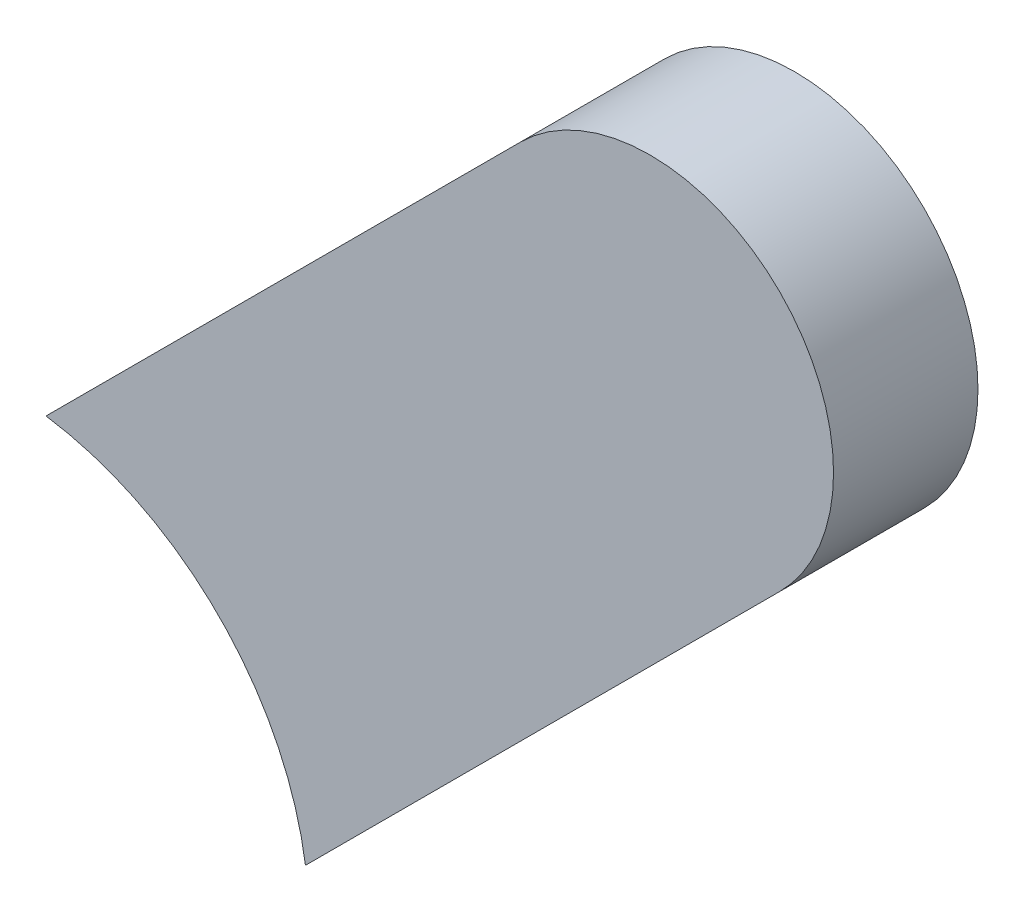
ISO-10303-21;
HEADER;
FILE_DESCRIPTION(('STEP AP214'),'2;1');
FILE_NAME('part.step','',(''),(''),'','','');
FILE_SCHEMA(('AUTOMOTIVE_DESIGN { 1 0 10303 214 1 1 1 1 }'));
ENDSEC;
DATA;
#1=APPLICATION_CONTEXT('core data for automotive mechanical design processes');
#2=APPLICATION_PROTOCOL_DEFINITION('international standard','automotive_design',2000,#1);
#3=PRODUCT_CONTEXT('',#1,'mechanical');
#4=PRODUCT('Part','Part','',(#3));
#5=PRODUCT_RELATED_PRODUCT_CATEGORY('part','',(#4));
#6=PRODUCT_DEFINITION_FORMATION('','',#4);
#7=PRODUCT_DEFINITION_CONTEXT('part definition',#1,'design');
#8=PRODUCT_DEFINITION('design','',#6,#7);
#9=PRODUCT_DEFINITION_SHAPE('','',#8);
#10=(LENGTH_UNIT() NAMED_UNIT(*) SI_UNIT(.MILLI.,.METRE.));
#11=(NAMED_UNIT(*) PLANE_ANGLE_UNIT() SI_UNIT($,.RADIAN.));
#12=(NAMED_UNIT(*) SI_UNIT($,.STERADIAN.) SOLID_ANGLE_UNIT());
#13=UNCERTAINTY_MEASURE_WITH_UNIT(LENGTH_MEASURE(1.E-05),#10,'distance_accuracy_value','');
#14=(GEOMETRIC_REPRESENTATION_CONTEXT(3) GLOBAL_UNCERTAINTY_ASSIGNED_CONTEXT((#13)) GLOBAL_UNIT_ASSIGNED_CONTEXT((#10,
#11,#12)) REPRESENTATION_CONTEXT('',''));
#15=CARTESIAN_POINT('',(0.,0.,0.));
#16=DIRECTION('',(0.,0.,1.));
#17=DIRECTION('',(1.,0.,0.));
#18=AXIS2_PLACEMENT_3D('',#15,#16,#17);
#19=CARTESIAN_POINT('',(110.91055071545,118.61274003545,0.));
#20=DIRECTION('',(-0.707106781186548,0.707106781186548,0.));
#21=DIRECTION('',(0.707106781186548,0.707106781186548,0.));
#22=AXIS2_PLACEMENT_3D('',#19,#20,#21);
#23=PLANE('',#22);
#24=DIRECTION('',(0.707106781186548,0.707106781186548,0.));
#25=VECTOR('',#24,1.);
#26=CARTESIAN_POINT('',(110.66960594,118.37179526,0.1999996));
#27=LINE('',#26,#25);
#28=CARTESIAN_POINT('',(110.91055071545,118.61274003545,0.1999996));
#29=VERTEX_POINT('',#28);
#30=CARTESIAN_POINT('',(111.56734354,119.26953286,0.1999996));
#31=VERTEX_POINT('',#30);
#32=EDGE_CURVE('E11',#29,#31,#27,.T.);
#33=ORIENTED_EDGE('',*,*,#32,.F.);
#34=DIRECTION('',(0.,0.,1.));
#35=VECTOR('',#34,1.);
#36=CARTESIAN_POINT('',(110.91055071545,118.61274003545,0.));
#37=LINE('',#36,#35);
#38=CARTESIAN_POINT('',(110.91055071545,118.61274003545,0.));
#39=VERTEX_POINT('',#38);
#40=EDGE_CURVE('E24',#39,#29,#37,.T.);
#41=ORIENTED_EDGE('',*,*,#40,.F.);
#42=DIRECTION('',(0.707106781186548,0.707106781186548,0.));
#43=VECTOR('',#42,1.);
#44=CARTESIAN_POINT('',(110.66960594,118.37179526,0.));
#45=LINE('',#44,#43);
#46=CARTESIAN_POINT('',(111.56734354,119.26953286,0.));
#47=VERTEX_POINT('',#46);
#48=EDGE_CURVE('E75',#39,#47,#45,.T.);
#49=ORIENTED_EDGE('',*,*,#48,.T.);
#50=DIRECTION('',(0.,0.,1.));
#51=VECTOR('',#50,1.);
#52=CARTESIAN_POINT('',(111.56734354,119.26953286,0.));
#53=LINE('',#52,#51);
#54=EDGE_CURVE('E37',#47,#31,#53,.T.);
#55=ORIENTED_EDGE('',*,*,#54,.T.);
#56=EDGE_LOOP('',(#33,#41,#49,#55));
#57=FACE_BOUND('',#56,.T.);
#58=ADVANCED_FACE('F17',(#57),#23,.F.);
#59=CARTESIAN_POINT('',(111.3877376,119.4491388,0.));
#60=DIRECTION('',(0.,0.,-1.));
#61=DIRECTION('',(0.70710678118652,-0.707106781186576,0.));
#62=AXIS2_PLACEMENT_3D('',#59,#60,#61);
#63=CYLINDRICAL_SURFACE('',#62,0.254001156230761);
#64=CARTESIAN_POINT('',(111.3877376,119.4491388,0.1999996));
#65=DIRECTION('',(0.,0.,1.));
#66=DIRECTION('',(0.70710678118652,-0.707106781186576,0.));
#67=AXIS2_PLACEMENT_3D('',#64,#65,#66);
#68=CIRCLE('',#67,0.254001156230761);
#69=CARTESIAN_POINT('',(111.20813166,119.62874474,0.1999996));
#70=VERTEX_POINT('',#69);
#71=EDGE_CURVE('E83',#31,#70,#68,.T.);
#72=ORIENTED_EDGE('',*,*,#71,.F.);
#73=ORIENTED_EDGE('',*,*,#54,.F.);
#74=CARTESIAN_POINT('',(111.3877376,119.4491388,0.));
#75=DIRECTION('',(0.,0.,1.));
#76=DIRECTION('',(0.70710678118652,-0.707106781186576,0.));
#77=AXIS2_PLACEMENT_3D('',#74,#75,#76);
#78=CIRCLE('',#77,0.254001156230761);
#79=CARTESIAN_POINT('',(111.20813166,119.62874474,0.));
#80=VERTEX_POINT('',#79);
#81=EDGE_CURVE('E81',#47,#80,#78,.T.);
#82=ORIENTED_EDGE('',*,*,#81,.T.);
#83=DIRECTION('',(0.,0.,1.));
#84=VECTOR('',#83,1.);
#85=CARTESIAN_POINT('',(111.20813166,119.62874474,0.));
#86=LINE('',#85,#84);
#87=EDGE_CURVE('E67',#80,#70,#86,.T.);
#88=ORIENTED_EDGE('',*,*,#87,.T.);
#89=EDGE_LOOP('',(#72,#73,#82,#88));
#90=FACE_BOUND('',#89,.T.);
#91=ADVANCED_FACE('F89',(#90),#63,.T.);
#92=CARTESIAN_POINT('',(111.20813166,119.62874474,0.));
#93=DIRECTION('',(0.707106781186531,-0.707106781186564,0.));
#94=DIRECTION('',(-0.707106781186564,-0.707106781186531,0.));
#95=AXIS2_PLACEMENT_3D('',#92,#93,#94);
#96=PLANE('',#95);
#97=DIRECTION('',(-0.707106781186564,-0.707106781186531,0.));
#98=VECTOR('',#97,1.);
#99=CARTESIAN_POINT('',(111.20813166,119.62874474,0.1999996));
#100=LINE('',#99,#98);
#101=CARTESIAN_POINT('',(110.55133883545,118.97195191545,0.1999996));
#102=VERTEX_POINT('',#101);
#103=EDGE_CURVE('E71',#70,#102,#100,.T.);
#104=ORIENTED_EDGE('',*,*,#103,.F.);
#105=ORIENTED_EDGE('',*,*,#87,.F.);
#106=DIRECTION('',(-0.707106781186564,-0.707106781186531,0.));
#107=VECTOR('',#106,1.);
#108=CARTESIAN_POINT('',(111.20813166,119.62874474,0.));
#109=LINE('',#108,#107);
#110=CARTESIAN_POINT('',(110.55133883545,118.97195191545,0.));
#111=VERTEX_POINT('',#110);
#112=EDGE_CURVE('E63',#80,#111,#109,.T.);
#113=ORIENTED_EDGE('',*,*,#112,.T.);
#114=DIRECTION('',(0.,0.,1.));
#115=VECTOR('',#114,1.);
#116=CARTESIAN_POINT('',(110.55133883545,118.97195191545,0.));
#117=LINE('',#116,#115);
#118=EDGE_CURVE('E53',#111,#102,#117,.T.);
#119=ORIENTED_EDGE('',*,*,#118,.T.);
#120=EDGE_LOOP('',(#104,#105,#113,#119));
#121=FACE_BOUND('',#120,.T.);
#122=ADVANCED_FACE('F66',(#121),#96,.F.);
#123=CARTESIAN_POINT('',(110.49,118.5514012,0.));
#124=DIRECTION('',(0.,0.,-1.));
#125=DIRECTION('',(1.,0.,0.));
#126=AXIS2_PLACEMENT_3D('',#123,#124,#125);
#127=CYLINDRICAL_SURFACE('',#126,0.42500042);
#128=ORIENTED_EDGE('',*,*,#40,.T.);
#129=CARTESIAN_POINT('',(110.49,118.5514012,0.1999996));
#130=DIRECTION('',(0.,0.,1.));
#131=DIRECTION('',(1.,0.,0.));
#132=AXIS2_PLACEMENT_3D('',#129,#130,#131);
#133=CIRCLE('',#132,0.42500042);
#134=EDGE_CURVE('E59',#29,#102,#133,.T.);
#135=ORIENTED_EDGE('',*,*,#134,.T.);
#136=ORIENTED_EDGE('',*,*,#118,.F.);
#137=CARTESIAN_POINT('',(110.49,118.5514012,0.));
#138=DIRECTION('',(0.,0.,1.));
#139=DIRECTION('',(1.,0.,0.));
#140=AXIS2_PLACEMENT_3D('',#137,#138,#139);
#141=CIRCLE('',#140,0.42500042);
#142=EDGE_CURVE('E57',#39,#111,#141,.T.);
#143=ORIENTED_EDGE('',*,*,#142,.F.);
#144=EDGE_LOOP('',(#128,#135,#136,#143));
#145=FACE_BOUND('',#144,.T.);
#146=ADVANCED_FACE('F55',(#145),#127,.F.);
#147=CARTESIAN_POINT('',(110.66960594,118.37179526,0.));
#148=DIRECTION('',(0.,0.,-1.));
#149=DIRECTION('',(-1.,0.,0.));
#150=AXIS2_PLACEMENT_3D('',#147,#148,#149);
#151=PLANE('',#150);
#152=ORIENTED_EDGE('',*,*,#48,.F.);
#153=ORIENTED_EDGE('',*,*,#142,.T.);
#154=ORIENTED_EDGE('',*,*,#112,.F.);
#155=ORIENTED_EDGE('',*,*,#81,.F.);
#156=EDGE_LOOP('',(#152,#153,#154,#155));
#157=FACE_BOUND('',#156,.T.);
#158=ADVANCED_FACE('F74',(#157),#151,.T.);
#159=CARTESIAN_POINT('',(110.66960594,118.37179526,0.1999996));
#160=DIRECTION('',(0.,0.,-1.));
#161=DIRECTION('',(-1.,0.,0.));
#162=AXIS2_PLACEMENT_3D('',#159,#160,#161);
#163=PLANE('',#162);
#164=ORIENTED_EDGE('',*,*,#134,.F.);
#165=ORIENTED_EDGE('',*,*,#32,.T.);
#166=ORIENTED_EDGE('',*,*,#71,.T.);
#167=ORIENTED_EDGE('',*,*,#103,.T.);
#168=EDGE_LOOP('',(#164,#165,#166,#167));
#169=FACE_BOUND('',#168,.T.);
#170=ADVANCED_FACE('F91',(#169),#163,.F.);
#171=CLOSED_SHELL('',(#58,#91,#122,#146,#158,#170));
#172=MANIFOLD_SOLID_BREP('B1',#171);
#173=ADVANCED_BREP_SHAPE_REPRESENTATION('',(#18,#172),#14);
#174=SHAPE_DEFINITION_REPRESENTATION(#9,#173);
ENDSEC;
END-ISO-10303-21;
